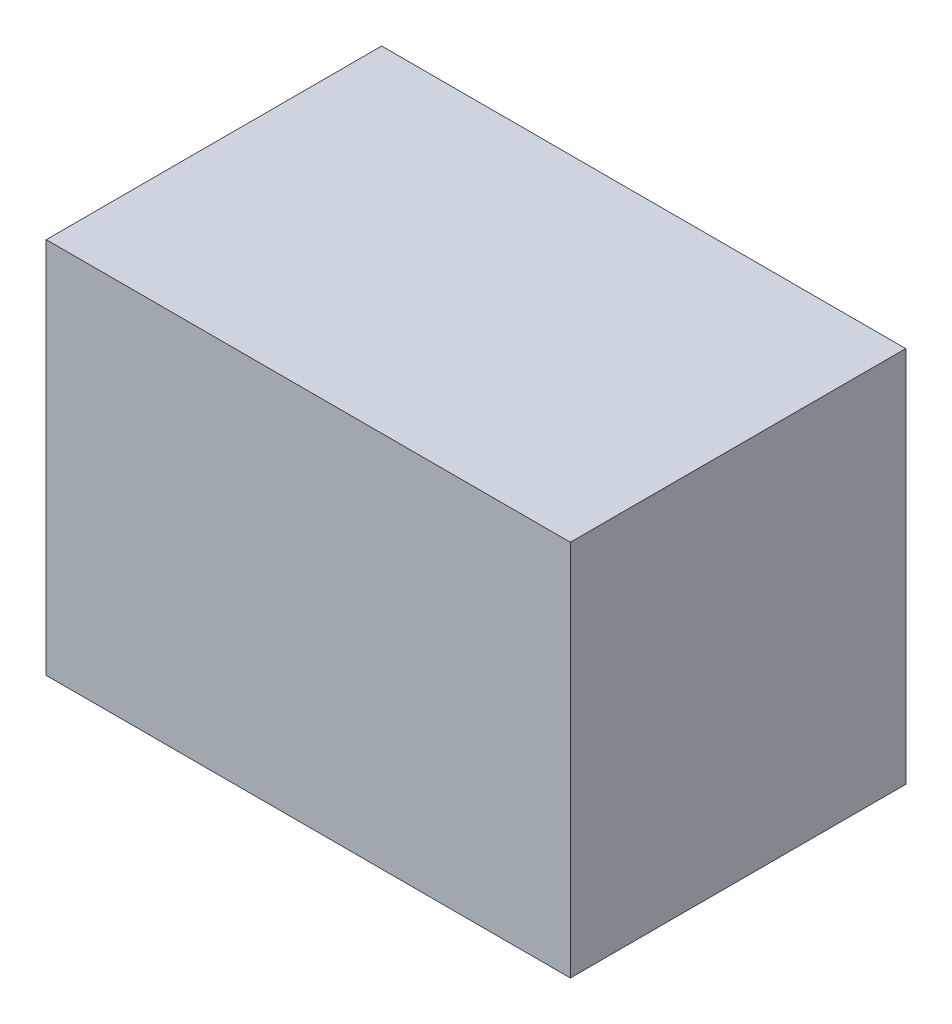
ISO-10303-21;
HEADER;
FILE_DESCRIPTION(('STEP AP214'),'2;1');
FILE_NAME('part.step','',(''),(''),'','','');
FILE_SCHEMA(('AUTOMOTIVE_DESIGN { 1 0 10303 214 1 1 1 1 }'));
ENDSEC;
DATA;
#1=APPLICATION_CONTEXT('core data for automotive mechanical design processes');
#2=APPLICATION_PROTOCOL_DEFINITION('international standard','automotive_design',2000,#1);
#3=PRODUCT_CONTEXT('',#1,'mechanical');
#4=PRODUCT('Part','Part','',(#3));
#5=PRODUCT_RELATED_PRODUCT_CATEGORY('part','',(#4));
#6=PRODUCT_DEFINITION_FORMATION('','',#4);
#7=PRODUCT_DEFINITION_CONTEXT('part definition',#1,'design');
#8=PRODUCT_DEFINITION('design','',#6,#7);
#9=PRODUCT_DEFINITION_SHAPE('','',#8);
#10=(LENGTH_UNIT() NAMED_UNIT(*) SI_UNIT(.MILLI.,.METRE.));
#11=(NAMED_UNIT(*) PLANE_ANGLE_UNIT() SI_UNIT($,.RADIAN.));
#12=(NAMED_UNIT(*) SI_UNIT($,.STERADIAN.) SOLID_ANGLE_UNIT());
#13=UNCERTAINTY_MEASURE_WITH_UNIT(LENGTH_MEASURE(1.E-05),#10,'distance_accuracy_value','');
#14=(GEOMETRIC_REPRESENTATION_CONTEXT(3) GLOBAL_UNCERTAINTY_ASSIGNED_CONTEXT((#13)) GLOBAL_UNIT_ASSIGNED_CONTEXT((#10,
#11,#12)) REPRESENTATION_CONTEXT('',''));
#15=CARTESIAN_POINT('',(0.,0.,0.));
#16=DIRECTION('',(0.,0.,1.));
#17=DIRECTION('',(1.,0.,0.));
#18=AXIS2_PLACEMENT_3D('',#15,#16,#17);
#19=CARTESIAN_POINT('',(62.5,90.,40.));
#20=DIRECTION('',(-1.,0.,0.));
#21=DIRECTION('',(0.,0.,1.));
#22=AXIS2_PLACEMENT_3D('',#19,#20,#21);
#23=PLANE('',#22);
#24=DIRECTION('',(0.,0.,-1.));
#25=VECTOR('',#24,1.);
#26=CARTESIAN_POINT('',(62.5,0.,40.));
#27=LINE('',#26,#25);
#28=CARTESIAN_POINT('',(62.5,0.,40.));
#29=VERTEX_POINT('',#28);
#30=CARTESIAN_POINT('',(62.5,0.,-40.));
#31=VERTEX_POINT('',#30);
#32=EDGE_CURVE('E108',#29,#31,#27,.T.);
#33=ORIENTED_EDGE('',*,*,#32,.T.);
#34=DIRECTION('',(0.,-1.,0.));
#35=VECTOR('',#34,1.);
#36=CARTESIAN_POINT('',(62.5,90.,-40.));
#37=LINE('',#36,#35);
#38=CARTESIAN_POINT('',(62.5,90.,-40.));
#39=VERTEX_POINT('',#38);
#40=EDGE_CURVE('E11',#39,#31,#37,.T.);
#41=ORIENTED_EDGE('',*,*,#40,.F.);
#42=DIRECTION('',(0.,0.,-1.));
#43=VECTOR('',#42,1.);
#44=CARTESIAN_POINT('',(62.5,90.,40.));
#45=LINE('',#44,#43);
#46=CARTESIAN_POINT('',(62.5,90.,40.));
#47=VERTEX_POINT('',#46);
#48=EDGE_CURVE('E96',#47,#39,#45,.T.);
#49=ORIENTED_EDGE('',*,*,#48,.F.);
#50=DIRECTION('',(0.,-1.,0.));
#51=VECTOR('',#50,1.);
#52=CARTESIAN_POINT('',(62.5,90.,40.));
#53=LINE('',#52,#51);
#54=EDGE_CURVE('E104',#47,#29,#53,.T.);
#55=ORIENTED_EDGE('',*,*,#54,.T.);
#56=EDGE_LOOP('',(#33,#41,#49,#55));
#57=FACE_BOUND('',#56,.T.);
#58=ADVANCED_FACE('F45',(#57),#23,.F.);
#59=CARTESIAN_POINT('',(-62.5,90.,-40.));
#60=DIRECTION('',(0.,0.,1.));
#61=DIRECTION('',(1.,0.,0.));
#62=AXIS2_PLACEMENT_3D('',#59,#60,#61);
#63=PLANE('',#62);
#64=DIRECTION('',(-1.,0.,0.));
#65=VECTOR('',#64,1.);
#66=CARTESIAN_POINT('',(-62.5,0.,-40.));
#67=LINE('',#66,#65);
#68=CARTESIAN_POINT('',(-62.5,0.,-40.));
#69=VERTEX_POINT('',#68);
#70=EDGE_CURVE('E100',#31,#69,#67,.T.);
#71=ORIENTED_EDGE('',*,*,#70,.T.);
#72=DIRECTION('',(0.,-1.,0.));
#73=VECTOR('',#72,1.);
#74=CARTESIAN_POINT('',(-62.5,90.,-40.));
#75=LINE('',#74,#73);
#76=CARTESIAN_POINT('',(-62.5,90.,-40.));
#77=VERTEX_POINT('',#76);
#78=EDGE_CURVE('E53',#77,#69,#75,.T.);
#79=ORIENTED_EDGE('',*,*,#78,.F.);
#80=DIRECTION('',(-1.,0.,0.));
#81=VECTOR('',#80,1.);
#82=CARTESIAN_POINT('',(-62.5,90.,-40.));
#83=LINE('',#82,#81);
#84=EDGE_CURVE('E91',#39,#77,#83,.T.);
#85=ORIENTED_EDGE('',*,*,#84,.F.);
#86=ORIENTED_EDGE('',*,*,#40,.T.);
#87=EDGE_LOOP('',(#71,#79,#85,#86));
#88=FACE_BOUND('',#87,.T.);
#89=ADVANCED_FACE('F99',(#88),#63,.F.);
#90=CARTESIAN_POINT('',(-62.5,90.,40.));
#91=DIRECTION('',(1.,0.,0.));
#92=DIRECTION('',(0.,0.,-1.));
#93=AXIS2_PLACEMENT_3D('',#90,#91,#92);
#94=PLANE('',#93);
#95=DIRECTION('',(0.,0.,1.));
#96=VECTOR('',#95,1.);
#97=CARTESIAN_POINT('',(-62.5,0.,40.));
#98=LINE('',#97,#96);
#99=CARTESIAN_POINT('',(-62.5,0.,40.));
#100=VERTEX_POINT('',#99);
#101=EDGE_CURVE('E78',#69,#100,#98,.T.);
#102=ORIENTED_EDGE('',*,*,#101,.T.);
#103=DIRECTION('',(0.,-1.,0.));
#104=VECTOR('',#103,1.);
#105=CARTESIAN_POINT('',(-62.5,90.,40.));
#106=LINE('',#105,#104);
#107=CARTESIAN_POINT('',(-62.5,90.,40.));
#108=VERTEX_POINT('',#107);
#109=EDGE_CURVE('E101',#108,#100,#106,.T.);
#110=ORIENTED_EDGE('',*,*,#109,.F.);
#111=DIRECTION('',(0.,0.,1.));
#112=VECTOR('',#111,1.);
#113=CARTESIAN_POINT('',(-62.5,90.,40.));
#114=LINE('',#113,#112);
#115=EDGE_CURVE('E94',#77,#108,#114,.T.);
#116=ORIENTED_EDGE('',*,*,#115,.F.);
#117=ORIENTED_EDGE('',*,*,#78,.T.);
#118=EDGE_LOOP('',(#102,#110,#116,#117));
#119=FACE_BOUND('',#118,.T.);
#120=ADVANCED_FACE('F102',(#119),#94,.F.);
#121=CARTESIAN_POINT('',(-62.5,90.,40.));
#122=DIRECTION('',(0.,0.,-1.));
#123=DIRECTION('',(-1.,0.,0.));
#124=AXIS2_PLACEMENT_3D('',#121,#122,#123);
#125=PLANE('',#124);
#126=DIRECTION('',(1.,0.,0.));
#127=VECTOR('',#126,1.);
#128=CARTESIAN_POINT('',(-62.5,0.,40.));
#129=LINE('',#128,#127);
#130=EDGE_CURVE('E84',#100,#29,#129,.T.);
#131=ORIENTED_EDGE('',*,*,#130,.T.);
#132=ORIENTED_EDGE('',*,*,#54,.F.);
#133=DIRECTION('',(1.,0.,0.));
#134=VECTOR('',#133,1.);
#135=CARTESIAN_POINT('',(-62.5,90.,40.));
#136=LINE('',#135,#134);
#137=EDGE_CURVE('E61',#108,#47,#136,.T.);
#138=ORIENTED_EDGE('',*,*,#137,.F.);
#139=ORIENTED_EDGE('',*,*,#109,.T.);
#140=EDGE_LOOP('',(#131,#132,#138,#139));
#141=FACE_BOUND('',#140,.T.);
#142=ADVANCED_FACE('F115',(#141),#125,.F.);
#143=CARTESIAN_POINT('',(0.,90.,0.));
#144=DIRECTION('',(0.,-1.,0.));
#145=DIRECTION('',(0.,0.,-1.));
#146=AXIS2_PLACEMENT_3D('',#143,#144,#145);
#147=PLANE('',#146);
#148=ORIENTED_EDGE('',*,*,#48,.T.);
#149=ORIENTED_EDGE('',*,*,#84,.T.);
#150=ORIENTED_EDGE('',*,*,#115,.T.);
#151=ORIENTED_EDGE('',*,*,#137,.T.);
#152=EDGE_LOOP('',(#148,#149,#150,#151));
#153=FACE_BOUND('',#152,.T.);
#154=ADVANCED_FACE('F92',(#153),#147,.F.);
#155=CARTESIAN_POINT('',(0.,0.,0.));
#156=DIRECTION('',(0.,-1.,0.));
#157=DIRECTION('',(0.,0.,-1.));
#158=AXIS2_PLACEMENT_3D('',#155,#156,#157);
#159=PLANE('',#158);
#160=ORIENTED_EDGE('',*,*,#32,.F.);
#161=ORIENTED_EDGE('',*,*,#130,.F.);
#162=ORIENTED_EDGE('',*,*,#101,.F.);
#163=ORIENTED_EDGE('',*,*,#70,.F.);
#164=EDGE_LOOP('',(#160,#161,#162,#163));
#165=FACE_BOUND('',#164,.T.);
#166=ADVANCED_FACE('F118',(#165),#159,.T.);
#167=CLOSED_SHELL('',(#58,#89,#120,#142,#154,#166));
#168=MANIFOLD_SOLID_BREP('B2',#167);
#169=ADVANCED_BREP_SHAPE_REPRESENTATION('',(#18,#168),#14);
#170=SHAPE_DEFINITION_REPRESENTATION(#9,#169);
ENDSEC;
END-ISO-10303-21;
